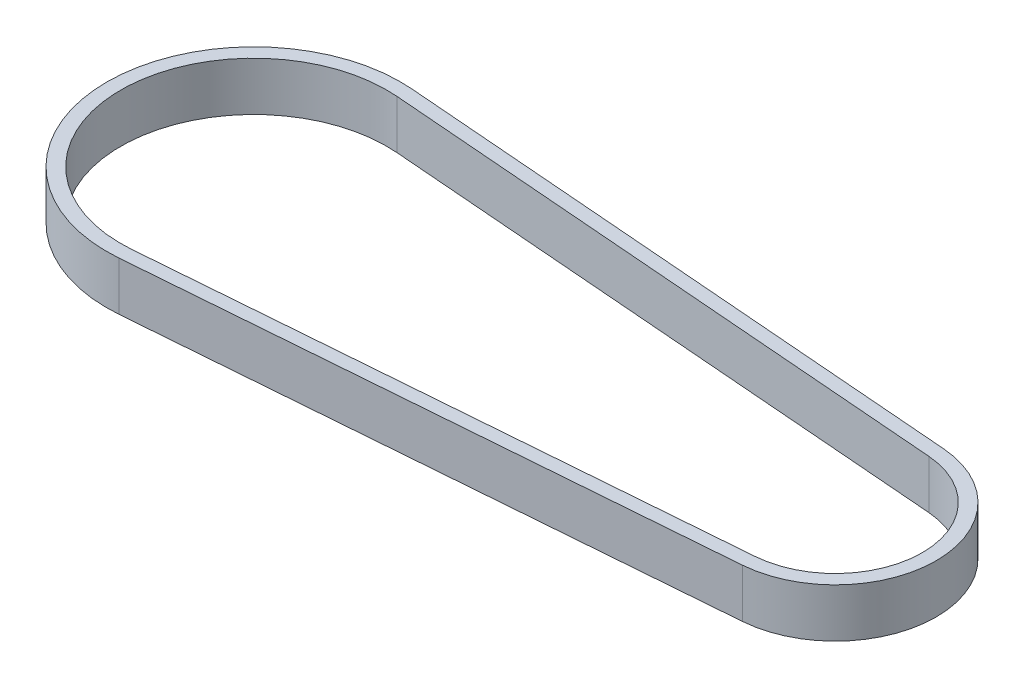
ISO-10303-21;
HEADER;
FILE_DESCRIPTION(('STEP AP214'),'2;1');
FILE_NAME('part.step','',(''),(''),'','','');
FILE_SCHEMA(('AUTOMOTIVE_DESIGN { 1 0 10303 214 1 1 1 1 }'));
ENDSEC;
DATA;
#1=APPLICATION_CONTEXT('core data for automotive mechanical design processes');
#2=APPLICATION_PROTOCOL_DEFINITION('international standard','automotive_design',2000,#1);
#3=PRODUCT_CONTEXT('',#1,'mechanical');
#4=PRODUCT('Part','Part','',(#3));
#5=PRODUCT_RELATED_PRODUCT_CATEGORY('part','',(#4));
#6=PRODUCT_DEFINITION_FORMATION('','',#4);
#7=PRODUCT_DEFINITION_CONTEXT('part definition',#1,'design');
#8=PRODUCT_DEFINITION('design','',#6,#7);
#9=PRODUCT_DEFINITION_SHAPE('','',#8);
#10=(LENGTH_UNIT() NAMED_UNIT(*) SI_UNIT(.MILLI.,.METRE.));
#11=(NAMED_UNIT(*) PLANE_ANGLE_UNIT() SI_UNIT($,.RADIAN.));
#12=(NAMED_UNIT(*) SI_UNIT($,.STERADIAN.) SOLID_ANGLE_UNIT());
#13=UNCERTAINTY_MEASURE_WITH_UNIT(LENGTH_MEASURE(1.E-05),#10,'distance_accuracy_value','');
#14=(GEOMETRIC_REPRESENTATION_CONTEXT(3) GLOBAL_UNCERTAINTY_ASSIGNED_CONTEXT((#13)) GLOBAL_UNIT_ASSIGNED_CONTEXT((#10,
#11,#12)) REPRESENTATION_CONTEXT('',''));
#15=CARTESIAN_POINT('',(0.,0.,0.));
#16=DIRECTION('',(0.,0.,1.));
#17=DIRECTION('',(1.,0.,0.));
#18=AXIS2_PLACEMENT_3D('',#15,#16,#17);
#19=CARTESIAN_POINT('',(1.66652521562051,7.,-21.0290684222031));
#20=DIRECTION('',(0.0790009583133684,0.,-0.996874540042813));
#21=DIRECTION('',(-0.996874540042813,0.,-0.0790009583133684));
#22=AXIS2_PLACEMENT_3D('',#19,#20,#21);
#23=PLANE('',#22);
#24=DIRECTION('',(0.996874540042813,0.,0.0790009583133684));
#25=VECTOR('',#24,1.);
#26=CARTESIAN_POINT('',(1.66652521562051,0.,-21.0290684222031));
#27=LINE('',#26,#25);
#28=CARTESIAN_POINT('',(1.66652521562051,0.,-21.0290684222031));
#29=VERTEX_POINT('',#28);
#30=CARTESIAN_POINT('',(84.6255138955438,0.,-14.4546808306208));
#31=VERTEX_POINT('',#30);
#32=EDGE_CURVE('E149',#29,#31,#27,.T.);
#33=ORIENTED_EDGE('',*,*,#32,.F.);
#34=DIRECTION('',(0.,-1.,0.));
#35=VECTOR('',#34,1.);
#36=CARTESIAN_POINT('',(1.66652521562051,7.,-21.0290684222031));
#37=LINE('',#36,#35);
#38=CARTESIAN_POINT('',(1.66652521562051,7.,-21.0290684222031));
#39=VERTEX_POINT('',#38);
#40=EDGE_CURVE('E11',#39,#29,#37,.T.);
#41=ORIENTED_EDGE('',*,*,#40,.F.);
#42=DIRECTION('',(0.996874540042813,0.,0.0790009583133684));
#43=VECTOR('',#42,1.);
#44=CARTESIAN_POINT('',(1.66652521562051,7.,-21.0290684222031));
#45=LINE('',#44,#43);
#46=CARTESIAN_POINT('',(84.6255138955438,7.,-14.4546808306208));
#47=VERTEX_POINT('',#46);
#48=EDGE_CURVE('E120',#39,#47,#45,.T.);
#49=ORIENTED_EDGE('',*,*,#48,.T.);
#50=DIRECTION('',(0.,-1.,0.));
#51=VECTOR('',#50,1.);
#52=CARTESIAN_POINT('',(84.6255138955438,7.,-14.4546808306208));
#53=LINE('',#52,#51);
#54=EDGE_CURVE('E94',#47,#31,#53,.T.);
#55=ORIENTED_EDGE('',*,*,#54,.T.);
#56=EDGE_LOOP('',(#33,#41,#49,#55));
#57=FACE_BOUND('',#56,.T.);
#58=ADVANCED_FACE('F41',(#57),#23,.T.);
#59=CARTESIAN_POINT('',(0.,7.,0.));
#60=DIRECTION('',(0.,-1.,0.));
#61=DIRECTION('',(0.,0.,-1.));
#62=AXIS2_PLACEMENT_3D('',#59,#60,#61);
#63=CYLINDRICAL_SURFACE('',#62,21.095);
#64=CARTESIAN_POINT('',(0.,0.,0.));
#65=DIRECTION('',(0.,1.,0.));
#66=DIRECTION('',(0.,0.,1.));
#67=AXIS2_PLACEMENT_3D('',#64,#65,#66);
#68=CIRCLE('',#67,21.095);
#69=CARTESIAN_POINT('',(1.66652521562051,0.,21.0290684222031));
#70=VERTEX_POINT('',#69);
#71=EDGE_CURVE('E126',#29,#70,#68,.T.);
#72=ORIENTED_EDGE('',*,*,#71,.T.);
#73=DIRECTION('',(0.,-1.,0.));
#74=VECTOR('',#73,1.);
#75=CARTESIAN_POINT('',(1.66652521562051,7.,21.0290684222031));
#76=LINE('',#75,#74);
#77=CARTESIAN_POINT('',(1.66652521562051,7.,21.0290684222031));
#78=VERTEX_POINT('',#77);
#79=EDGE_CURVE('E51',#78,#70,#76,.T.);
#80=ORIENTED_EDGE('',*,*,#79,.F.);
#81=CARTESIAN_POINT('',(0.,7.,0.));
#82=DIRECTION('',(0.,1.,0.));
#83=DIRECTION('',(0.,0.,1.));
#84=AXIS2_PLACEMENT_3D('',#81,#82,#83);
#85=CIRCLE('',#84,21.095);
#86=EDGE_CURVE('E115',#39,#78,#85,.T.);
#87=ORIENTED_EDGE('',*,*,#86,.F.);
#88=ORIENTED_EDGE('',*,*,#40,.T.);
#89=EDGE_LOOP('',(#72,#80,#87,#88));
#90=FACE_BOUND('',#89,.T.);
#91=ADVANCED_FACE('F124',(#90),#63,.T.);
#92=CARTESIAN_POINT('',(1.66652521562051,7.,21.0290684222031));
#93=DIRECTION('',(0.0790009583133684,0.,0.996874540042813));
#94=DIRECTION('',(0.996874540042813,0.,-0.0790009583133684));
#95=AXIS2_PLACEMENT_3D('',#92,#93,#94);
#96=PLANE('',#95);
#97=DIRECTION('',(-0.996874540042813,0.,0.0790009583133684));
#98=VECTOR('',#97,1.);
#99=CARTESIAN_POINT('',(1.66652521562051,0.,21.0290684222031));
#100=LINE('',#99,#98);
#101=CARTESIAN_POINT('',(84.6255138955438,0.,14.4546808306208));
#102=VERTEX_POINT('',#101);
#103=EDGE_CURVE('E153',#102,#70,#100,.T.);
#104=ORIENTED_EDGE('',*,*,#103,.F.);
#105=DIRECTION('',(0.,-1.,0.));
#106=VECTOR('',#105,1.);
#107=CARTESIAN_POINT('',(84.6255138955438,7.,14.4546808306208));
#108=LINE('',#107,#106);
#109=CARTESIAN_POINT('',(84.6255138955438,7.,14.4546808306208));
#110=VERTEX_POINT('',#109);
#111=EDGE_CURVE('E87',#110,#102,#108,.T.);
#112=ORIENTED_EDGE('',*,*,#111,.F.);
#113=DIRECTION('',(-0.996874540042813,0.,0.0790009583133684));
#114=VECTOR('',#113,1.);
#115=CARTESIAN_POINT('',(1.66652521562051,7.,21.0290684222031));
#116=LINE('',#115,#114);
#117=EDGE_CURVE('E119',#110,#78,#116,.T.);
#118=ORIENTED_EDGE('',*,*,#117,.T.);
#119=ORIENTED_EDGE('',*,*,#79,.T.);
#120=EDGE_LOOP('',(#104,#112,#118,#119));
#121=FACE_BOUND('',#120,.T.);
#122=ADVANCED_FACE('F131',(#121),#96,.T.);
#123=CARTESIAN_POINT('',(83.48,7.,0.));
#124=DIRECTION('',(0.,-1.,0.));
#125=DIRECTION('',(0.,0.,-1.));
#126=AXIS2_PLACEMENT_3D('',#123,#124,#125);
#127=CYLINDRICAL_SURFACE('',#126,12.5);
#128=CARTESIAN_POINT('',(83.48,0.,0.));
#129=DIRECTION('',(0.,1.,0.));
#130=DIRECTION('',(0.,0.,1.));
#131=AXIS2_PLACEMENT_3D('',#128,#129,#130);
#132=CIRCLE('',#131,12.5);
#133=CARTESIAN_POINT('',(84.4675119789171,0.,12.4609317505352));
#134=VERTEX_POINT('',#133);
#135=CARTESIAN_POINT('',(84.4675119789171,0.,-12.4609317505352));
#136=VERTEX_POINT('',#135);
#137=EDGE_CURVE('E137',#134,#136,#132,.T.);
#138=ORIENTED_EDGE('',*,*,#137,.F.);
#139=DIRECTION('',(0.,-1.,0.));
#140=VECTOR('',#139,1.);
#141=CARTESIAN_POINT('',(84.4675119789171,7.,12.4609317505352));
#142=LINE('',#141,#140);
#143=CARTESIAN_POINT('',(84.4675119789171,7.,12.4609317505352));
#144=VERTEX_POINT('',#143);
#145=EDGE_CURVE('E45',#144,#134,#142,.T.);
#146=ORIENTED_EDGE('',*,*,#145,.F.);
#147=CARTESIAN_POINT('',(83.48,7.,0.));
#148=DIRECTION('',(0.,1.,0.));
#149=DIRECTION('',(0.,0.,1.));
#150=AXIS2_PLACEMENT_3D('',#147,#148,#149);
#151=CIRCLE('',#150,12.5);
#152=CARTESIAN_POINT('',(84.4675119789171,7.,-12.4609317505352));
#153=VERTEX_POINT('',#152);
#154=EDGE_CURVE('E157',#144,#153,#151,.T.);
#155=ORIENTED_EDGE('',*,*,#154,.T.);
#156=DIRECTION('',(0.,-1.,0.));
#157=VECTOR('',#156,1.);
#158=CARTESIAN_POINT('',(84.4675119789171,7.,-12.4609317505352));
#159=LINE('',#158,#157);
#160=EDGE_CURVE('E133',#153,#136,#159,.T.);
#161=ORIENTED_EDGE('',*,*,#160,.T.);
#162=EDGE_LOOP('',(#138,#146,#155,#161));
#163=FACE_BOUND('',#162,.T.);
#164=ADVANCED_FACE('F43',(#163),#127,.F.);
#165=CARTESIAN_POINT('',(1.50852329899377,7.,19.0353193421175));
#166=DIRECTION('',(0.0790009583133685,0.,0.996874540042813));
#167=DIRECTION('',(0.996874540042813,0.,-0.0790009583133685));
#168=AXIS2_PLACEMENT_3D('',#165,#166,#167);
#169=PLANE('',#168);
#170=DIRECTION('',(-0.996874540042813,0.,0.0790009583133685));
#171=VECTOR('',#170,1.);
#172=CARTESIAN_POINT('',(1.50852329899377,0.,19.0353193421175));
#173=LINE('',#172,#171);
#174=CARTESIAN_POINT('',(1.50852329899377,0.,19.0353193421175));
#175=VERTEX_POINT('',#174);
#176=EDGE_CURVE('E140',#134,#175,#173,.T.);
#177=ORIENTED_EDGE('',*,*,#176,.T.);
#178=DIRECTION('',(0.,-1.,0.));
#179=VECTOR('',#178,1.);
#180=CARTESIAN_POINT('',(1.50852329899377,7.,19.0353193421175));
#181=LINE('',#180,#179);
#182=CARTESIAN_POINT('',(1.50852329899377,7.,19.0353193421175));
#183=VERTEX_POINT('',#182);
#184=EDGE_CURVE('E162',#183,#175,#181,.T.);
#185=ORIENTED_EDGE('',*,*,#184,.F.);
#186=DIRECTION('',(-0.996874540042813,0.,0.0790009583133685));
#187=VECTOR('',#186,1.);
#188=CARTESIAN_POINT('',(1.50852329899377,7.,19.0353193421175));
#189=LINE('',#188,#187);
#190=EDGE_CURVE('E170',#144,#183,#189,.T.);
#191=ORIENTED_EDGE('',*,*,#190,.F.);
#192=ORIENTED_EDGE('',*,*,#145,.T.);
#193=EDGE_LOOP('',(#177,#185,#191,#192));
#194=FACE_BOUND('',#193,.T.);
#195=ADVANCED_FACE('F169',(#194),#169,.F.);
#196=CARTESIAN_POINT('',(0.,7.,0.));
#197=DIRECTION('',(0.,-1.,0.));
#198=DIRECTION('',(0.,0.,-1.));
#199=AXIS2_PLACEMENT_3D('',#196,#197,#198);
#200=CYLINDRICAL_SURFACE('',#199,19.095);
#201=CARTESIAN_POINT('',(0.,0.,0.));
#202=DIRECTION('',(0.,1.,0.));
#203=DIRECTION('',(0.,0.,1.));
#204=AXIS2_PLACEMENT_3D('',#201,#202,#203);
#205=CIRCLE('',#204,19.095);
#206=CARTESIAN_POINT('',(1.50852329899377,0.,-19.0353193421175));
#207=VERTEX_POINT('',#206);
#208=EDGE_CURVE('E143',#207,#175,#205,.T.);
#209=ORIENTED_EDGE('',*,*,#208,.F.);
#210=DIRECTION('',(0.,-1.,0.));
#211=VECTOR('',#210,1.);
#212=CARTESIAN_POINT('',(1.50852329899377,7.,-19.0353193421175));
#213=LINE('',#212,#211);
#214=CARTESIAN_POINT('',(1.50852329899377,7.,-19.0353193421175));
#215=VERTEX_POINT('',#214);
#216=EDGE_CURVE('E161',#215,#207,#213,.T.);
#217=ORIENTED_EDGE('',*,*,#216,.F.);
#218=CARTESIAN_POINT('',(0.,7.,0.));
#219=DIRECTION('',(0.,1.,0.));
#220=DIRECTION('',(0.,0.,1.));
#221=AXIS2_PLACEMENT_3D('',#218,#219,#220);
#222=CIRCLE('',#221,19.095);
#223=EDGE_CURVE('E182',#215,#183,#222,.T.);
#224=ORIENTED_EDGE('',*,*,#223,.T.);
#225=ORIENTED_EDGE('',*,*,#184,.T.);
#226=EDGE_LOOP('',(#209,#217,#224,#225));
#227=FACE_BOUND('',#226,.T.);
#228=ADVANCED_FACE('F180',(#227),#200,.F.);
#229=CARTESIAN_POINT('',(1.50852329899377,7.,-19.0353193421175));
#230=DIRECTION('',(0.0790009583133685,0.,-0.996874540042813));
#231=DIRECTION('',(-0.996874540042813,0.,-0.0790009583133685));
#232=AXIS2_PLACEMENT_3D('',#229,#230,#231);
#233=PLANE('',#232);
#234=DIRECTION('',(0.996874540042813,0.,0.0790009583133685));
#235=VECTOR('',#234,1.);
#236=CARTESIAN_POINT('',(1.50852329899377,0.,-19.0353193421175));
#237=LINE('',#236,#235);
#238=EDGE_CURVE('E146',#207,#136,#237,.T.);
#239=ORIENTED_EDGE('',*,*,#238,.T.);
#240=ORIENTED_EDGE('',*,*,#160,.F.);
#241=DIRECTION('',(0.996874540042813,0.,0.0790009583133685));
#242=VECTOR('',#241,1.);
#243=CARTESIAN_POINT('',(1.50852329899377,7.,-19.0353193421175));
#244=LINE('',#243,#242);
#245=EDGE_CURVE('E183',#215,#153,#244,.T.);
#246=ORIENTED_EDGE('',*,*,#245,.F.);
#247=ORIENTED_EDGE('',*,*,#216,.T.);
#248=EDGE_LOOP('',(#239,#240,#246,#247));
#249=FACE_BOUND('',#248,.T.);
#250=ADVANCED_FACE('F179',(#249),#233,.F.);
#251=CARTESIAN_POINT('',(83.48,7.,0.));
#252=DIRECTION('',(0.,-1.,0.));
#253=DIRECTION('',(0.,0.,-1.));
#254=AXIS2_PLACEMENT_3D('',#251,#252,#253);
#255=CYLINDRICAL_SURFACE('',#254,14.5);
#256=CARTESIAN_POINT('',(83.48,0.,0.));
#257=DIRECTION('',(0.,1.,0.));
#258=DIRECTION('',(0.,0.,1.));
#259=AXIS2_PLACEMENT_3D('',#256,#257,#258);
#260=CIRCLE('',#259,14.5);
#261=EDGE_CURVE('E155',#102,#31,#260,.T.);
#262=ORIENTED_EDGE('',*,*,#261,.T.);
#263=ORIENTED_EDGE('',*,*,#54,.F.);
#264=CARTESIAN_POINT('',(83.48,7.,0.));
#265=DIRECTION('',(0.,1.,0.));
#266=DIRECTION('',(0.,0.,1.));
#267=AXIS2_PLACEMENT_3D('',#264,#265,#266);
#268=CIRCLE('',#267,14.5);
#269=EDGE_CURVE('E60',#110,#47,#268,.T.);
#270=ORIENTED_EDGE('',*,*,#269,.F.);
#271=ORIENTED_EDGE('',*,*,#111,.T.);
#272=EDGE_LOOP('',(#262,#263,#270,#271));
#273=FACE_BOUND('',#272,.T.);
#274=ADVANCED_FACE('F189',(#273),#255,.T.);
#275=CARTESIAN_POINT('',(0.,7.,0.));
#276=DIRECTION('',(0.,1.,0.));
#277=DIRECTION('',(0.,0.,1.));
#278=AXIS2_PLACEMENT_3D('',#275,#276,#277);
#279=PLANE('',#278);
#280=ORIENTED_EDGE('',*,*,#154,.F.);
#281=ORIENTED_EDGE('',*,*,#190,.T.);
#282=ORIENTED_EDGE('',*,*,#223,.F.);
#283=ORIENTED_EDGE('',*,*,#245,.T.);
#284=EDGE_LOOP('',(#280,#281,#282,#283));
#285=FACE_BOUND('',#284,.T.);
#286=ORIENTED_EDGE('',*,*,#48,.F.);
#287=ORIENTED_EDGE('',*,*,#86,.T.);
#288=ORIENTED_EDGE('',*,*,#117,.F.);
#289=ORIENTED_EDGE('',*,*,#269,.T.);
#290=EDGE_LOOP('',(#286,#287,#288,#289));
#291=FACE_BOUND('',#290,.T.);
#292=ADVANCED_FACE('F117',(#285,#291),#279,.T.);
#293=CARTESIAN_POINT('',(0.,0.,0.));
#294=DIRECTION('',(0.,1.,0.));
#295=DIRECTION('',(0.,0.,1.));
#296=AXIS2_PLACEMENT_3D('',#293,#294,#295);
#297=PLANE('',#296);
#298=ORIENTED_EDGE('',*,*,#137,.T.);
#299=ORIENTED_EDGE('',*,*,#238,.F.);
#300=ORIENTED_EDGE('',*,*,#208,.T.);
#301=ORIENTED_EDGE('',*,*,#176,.F.);
#302=EDGE_LOOP('',(#298,#299,#300,#301));
#303=FACE_BOUND('',#302,.T.);
#304=ORIENTED_EDGE('',*,*,#32,.T.);
#305=ORIENTED_EDGE('',*,*,#261,.F.);
#306=ORIENTED_EDGE('',*,*,#103,.T.);
#307=ORIENTED_EDGE('',*,*,#71,.F.);
#308=EDGE_LOOP('',(#304,#305,#306,#307));
#309=FACE_BOUND('',#308,.T.);
#310=ADVANCED_FACE('F173',(#303,#309),#297,.F.);
#311=CLOSED_SHELL('',(#58,#91,#122,#164,#195,#228,#250,#274,#292,#310));
#312=MANIFOLD_SOLID_BREP('B2',#311);
#313=ADVANCED_BREP_SHAPE_REPRESENTATION('',(#18,#312),#14);
#314=SHAPE_DEFINITION_REPRESENTATION(#9,#313);
ENDSEC;
END-ISO-10303-21;
